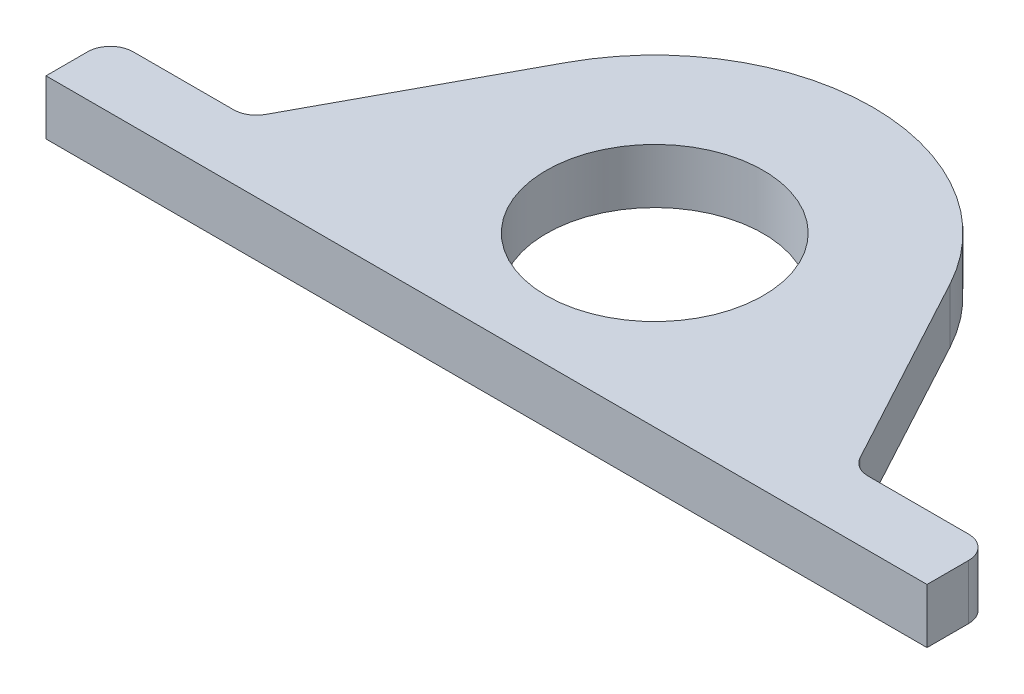
ISO-10303-21;
HEADER;
FILE_DESCRIPTION(('STEP AP214'),'2;1');
FILE_NAME('part.step','',(''),(''),'','','');
FILE_SCHEMA(('AUTOMOTIVE_DESIGN { 1 0 10303 214 1 1 1 1 }'));
ENDSEC;
DATA;
#1=APPLICATION_CONTEXT('core data for automotive mechanical design processes');
#2=APPLICATION_PROTOCOL_DEFINITION('international standard','automotive_design',2000,#1);
#3=PRODUCT_CONTEXT('',#1,'mechanical');
#4=PRODUCT('Part','Part','',(#3));
#5=PRODUCT_RELATED_PRODUCT_CATEGORY('part','',(#4));
#6=PRODUCT_DEFINITION_FORMATION('','',#4);
#7=PRODUCT_DEFINITION_CONTEXT('part definition',#1,'design');
#8=PRODUCT_DEFINITION('design','',#6,#7);
#9=PRODUCT_DEFINITION_SHAPE('','',#8);
#10=(LENGTH_UNIT() NAMED_UNIT(*) SI_UNIT(.MILLI.,.METRE.));
#11=(NAMED_UNIT(*) PLANE_ANGLE_UNIT() SI_UNIT($,.RADIAN.));
#12=(NAMED_UNIT(*) SI_UNIT($,.STERADIAN.) SOLID_ANGLE_UNIT());
#13=UNCERTAINTY_MEASURE_WITH_UNIT(LENGTH_MEASURE(1.E-05),#10,'distance_accuracy_value','');
#14=(GEOMETRIC_REPRESENTATION_CONTEXT(3) GLOBAL_UNCERTAINTY_ASSIGNED_CONTEXT((#13)) GLOBAL_UNIT_ASSIGNED_CONTEXT((#10,
#11,#12)) REPRESENTATION_CONTEXT('',''));
#15=CARTESIAN_POINT('',(0.,0.,0.));
#16=DIRECTION('',(0.,0.,1.));
#17=DIRECTION('',(1.,0.,0.));
#18=AXIS2_PLACEMENT_3D('',#15,#16,#17);
#19=CARTESIAN_POINT('',(-91.605676950577,12.,27.7755528274665));
#20=DIRECTION('',(0.,-1.,0.));
#21=DIRECTION('',(0.,0.,-1.));
#22=AXIS2_PLACEMENT_3D('',#19,#20,#21);
#23=PLANE('',#22);
#24=DIRECTION('',(0.,0.,1.));
#25=VECTOR('',#24,1.);
#26=CARTESIAN_POINT('',(-96.605676950577,12.,27.7755528274665));
#27=LINE('',#26,#25);
#28=CARTESIAN_POINT('',(-96.605676950577,12.,27.7755528274665));
#29=VERTEX_POINT('',#28);
#30=CARTESIAN_POINT('',(-96.605676950577,12.,36.9));
#31=VERTEX_POINT('',#30);
#32=EDGE_CURVE('E148',#29,#31,#27,.T.);
#33=ORIENTED_EDGE('',*,*,#32,.T.);
#34=DIRECTION('',(1.,0.,0.));
#35=VECTOR('',#34,1.);
#36=CARTESIAN_POINT('',(-91.605676950577,12.,36.9));
#37=LINE('',#36,#35);
#38=CARTESIAN_POINT('',(96.6056769505771,12.,36.9));
#39=VERTEX_POINT('',#38);
#40=EDGE_CURVE('E48',#31,#39,#37,.T.);
#41=ORIENTED_EDGE('',*,*,#40,.T.);
#42=DIRECTION('',(0.,0.,-1.));
#43=VECTOR('',#42,1.);
#44=CARTESIAN_POINT('',(96.605676950577,12.,27.7755528274665));
#45=LINE('',#44,#43);
#46=CARTESIAN_POINT('',(96.605676950577,12.,27.7755528274665));
#47=VERTEX_POINT('',#46);
#48=EDGE_CURVE('E102',#39,#47,#45,.T.);
#49=ORIENTED_EDGE('',*,*,#48,.T.);
#50=CARTESIAN_POINT('',(91.605676950577,12.,27.7755528274665));
#51=DIRECTION('',(0.,1.,0.));
#52=DIRECTION('',(0.,0.,-1.));
#53=AXIS2_PLACEMENT_3D('',#50,#51,#52);
#54=CIRCLE('',#53,5.00000000000001);
#55=CARTESIAN_POINT('',(91.605676950577,12.,22.7755528274664));
#56=VERTEX_POINT('',#55);
#57=EDGE_CURVE('E199',#47,#56,#54,.T.);
#58=ORIENTED_EDGE('',*,*,#57,.T.);
#59=DIRECTION('',(-1.,0.,0.));
#60=VECTOR('',#59,1.);
#61=CARTESIAN_POINT('',(69.5890954122525,12.,22.7755528274664));
#62=LINE('',#61,#60);
#63=CARTESIAN_POINT('',(69.5890954122525,12.,22.7755528274664));
#64=VERTEX_POINT('',#63);
#65=EDGE_CURVE('E221',#56,#64,#62,.T.);
#66=ORIENTED_EDGE('',*,*,#65,.T.);
#67=CARTESIAN_POINT('',(69.5890954122525,12.,17.7755528274664));
#68=DIRECTION('',(0.,-1.,0.));
#69=DIRECTION('',(0.,0.,1.));
#70=AXIS2_PLACEMENT_3D('',#67,#68,#69);
#71=CIRCLE('',#70,5.00000000000001);
#72=CARTESIAN_POINT('',(65.1888751835243,12.,20.1500131743014));
#73=VERTEX_POINT('',#72);
#74=EDGE_CURVE('E218',#64,#73,#71,.T.);
#75=ORIENTED_EDGE('',*,*,#74,.T.);
#76=DIRECTION('',(-0.474892069366983,0.,-0.880044045745635));
#77=VECTOR('',#76,1.);
#78=CARTESIAN_POINT('',(42.0661053866413,12.,-22.6998409157418));
#79=LINE('',#78,#77);
#80=CARTESIAN_POINT('',(42.0661053866413,12.,-22.6998409157418));
#81=VERTEX_POINT('',#80);
#82=EDGE_CURVE('E220',#73,#81,#79,.T.);
#83=ORIENTED_EDGE('',*,*,#82,.T.);
#84=CARTESIAN_POINT('',(0.,12.,0.));
#85=DIRECTION('',(0.,1.,0.));
#86=DIRECTION('',(0.,0.,1.));
#87=AXIS2_PLACEMENT_3D('',#84,#85,#86);
#88=CIRCLE('',#87,47.8);
#89=CARTESIAN_POINT('',(-42.0661053866413,12.,-22.6998409157417));
#90=VERTEX_POINT('',#89);
#91=EDGE_CURVE('E223',#81,#90,#88,.T.);
#92=ORIENTED_EDGE('',*,*,#91,.T.);
#93=DIRECTION('',(-0.474892069366983,0.,0.880044045745635));
#94=VECTOR('',#93,1.);
#95=CARTESIAN_POINT('',(-65.1888751835243,12.,20.1500131743014));
#96=LINE('',#95,#94);
#97=CARTESIAN_POINT('',(-65.1888751835243,12.,20.1500131743014));
#98=VERTEX_POINT('',#97);
#99=EDGE_CURVE('E131',#90,#98,#96,.T.);
#100=ORIENTED_EDGE('',*,*,#99,.T.);
#101=CARTESIAN_POINT('',(-69.5890954122525,12.,17.7755528274665));
#102=DIRECTION('',(0.,-1.,0.));
#103=DIRECTION('',(0.,0.,-1.));
#104=AXIS2_PLACEMENT_3D('',#101,#102,#103);
#105=CIRCLE('',#104,5.00000000000001);
#106=CARTESIAN_POINT('',(-69.5890954122525,12.,22.7755528274665));
#107=VERTEX_POINT('',#106);
#108=EDGE_CURVE('E124',#98,#107,#105,.T.);
#109=ORIENTED_EDGE('',*,*,#108,.T.);
#110=DIRECTION('',(-1.,0.,0.));
#111=VECTOR('',#110,1.);
#112=CARTESIAN_POINT('',(-69.5890954122525,12.,22.7755528274665));
#113=LINE('',#112,#111);
#114=CARTESIAN_POINT('',(-91.605676950577,12.,22.7755528274665));
#115=VERTEX_POINT('',#114);
#116=EDGE_CURVE('E128',#107,#115,#113,.T.);
#117=ORIENTED_EDGE('',*,*,#116,.T.);
#118=CARTESIAN_POINT('',(-91.605676950577,12.,27.7755528274665));
#119=DIRECTION('',(0.,1.,0.));
#120=DIRECTION('',(0.,0.,-1.));
#121=AXIS2_PLACEMENT_3D('',#118,#119,#120);
#122=CIRCLE('',#121,5.00000000000001);
#123=EDGE_CURVE('E56',#115,#29,#122,.T.);
#124=ORIENTED_EDGE('',*,*,#123,.T.);
#125=EDGE_LOOP('',(#33,#41,#49,#58,#66,#75,#83,#92,#100,#109,#117,#124));
#126=FACE_BOUND('',#125,.T.);
#127=CARTESIAN_POINT('',(0.,12.,0.));
#128=DIRECTION('',(0.,1.,0.));
#129=DIRECTION('',(0.,0.,1.));
#130=AXIS2_PLACEMENT_3D('',#127,#128,#129);
#131=CIRCLE('',#130,23.8);
#132=CARTESIAN_POINT('',(0.,12.,23.8));
#133=VERTEX_POINT('',#132);
#134=EDGE_CURVE('E157',#133,#133,#131,.T.);
#135=ORIENTED_EDGE('',*,*,#134,.F.);
#136=EDGE_LOOP('',(#135));
#137=FACE_BOUND('',#136,.T.);
#138=ADVANCED_FACE('F33',(#126,#137),#23,.F.);
#139=CARTESIAN_POINT('',(-91.605676950577,0.,27.7755528274665));
#140=DIRECTION('',(0.,-1.,0.));
#141=DIRECTION('',(0.,0.,-1.));
#142=AXIS2_PLACEMENT_3D('',#139,#140,#141);
#143=PLANE('',#142);
#144=DIRECTION('',(1.,0.,0.));
#145=VECTOR('',#144,1.);
#146=CARTESIAN_POINT('',(125.573108323714,0.,36.9));
#147=LINE('',#146,#145);
#148=CARTESIAN_POINT('',(-96.605676950577,0.,36.9));
#149=VERTEX_POINT('',#148);
#150=CARTESIAN_POINT('',(96.605676950577,0.,36.9));
#151=VERTEX_POINT('',#150);
#152=EDGE_CURVE('E243',#149,#151,#147,.T.);
#153=ORIENTED_EDGE('',*,*,#152,.F.);
#154=DIRECTION('',(0.,0.,1.));
#155=VECTOR('',#154,1.);
#156=CARTESIAN_POINT('',(-96.605676950577,0.,27.7755528274665));
#157=LINE('',#156,#155);
#158=CARTESIAN_POINT('',(-96.605676950577,0.,27.7755528274665));
#159=VERTEX_POINT('',#158);
#160=EDGE_CURVE('E173',#159,#149,#157,.T.);
#161=ORIENTED_EDGE('',*,*,#160,.F.);
#162=CARTESIAN_POINT('',(-91.605676950577,0.,27.7755528274665));
#163=DIRECTION('',(0.,1.,0.));
#164=DIRECTION('',(0.,0.,-1.));
#165=AXIS2_PLACEMENT_3D('',#162,#163,#164);
#166=CIRCLE('',#165,5.00000000000001);
#167=CARTESIAN_POINT('',(-91.605676950577,0.,22.7755528274665));
#168=VERTEX_POINT('',#167);
#169=EDGE_CURVE('E95',#168,#159,#166,.T.);
#170=ORIENTED_EDGE('',*,*,#169,.F.);
#171=DIRECTION('',(-1.,0.,0.));
#172=VECTOR('',#171,1.);
#173=CARTESIAN_POINT('',(-69.5890954122525,0.,22.7755528274665));
#174=LINE('',#173,#172);
#175=CARTESIAN_POINT('',(-69.5890954122525,0.,22.7755528274665));
#176=VERTEX_POINT('',#175);
#177=EDGE_CURVE('E170',#176,#168,#174,.T.);
#178=ORIENTED_EDGE('',*,*,#177,.F.);
#179=CARTESIAN_POINT('',(-69.5890954122525,0.,17.7755528274665));
#180=DIRECTION('',(0.,-1.,0.));
#181=DIRECTION('',(0.,0.,-1.));
#182=AXIS2_PLACEMENT_3D('',#179,#180,#181);
#183=CIRCLE('',#182,5.00000000000001);
#184=CARTESIAN_POINT('',(-65.1888751835243,0.,20.1500131743014));
#185=VERTEX_POINT('',#184);
#186=EDGE_CURVE('E140',#185,#176,#183,.T.);
#187=ORIENTED_EDGE('',*,*,#186,.F.);
#188=DIRECTION('',(-0.474892069366983,0.,0.880044045745635));
#189=VECTOR('',#188,1.);
#190=CARTESIAN_POINT('',(-65.1888751835243,0.,20.1500131743014));
#191=LINE('',#190,#189);
#192=CARTESIAN_POINT('',(-42.0661053866413,0.,-22.6998409157417));
#193=VERTEX_POINT('',#192);
#194=EDGE_CURVE('E167',#193,#185,#191,.T.);
#195=ORIENTED_EDGE('',*,*,#194,.F.);
#196=CARTESIAN_POINT('',(0.,0.,0.));
#197=DIRECTION('',(0.,1.,0.));
#198=DIRECTION('',(0.,0.,1.));
#199=AXIS2_PLACEMENT_3D('',#196,#197,#198);
#200=CIRCLE('',#199,47.8);
#201=CARTESIAN_POINT('',(42.0661053866413,0.,-22.6998409157418));
#202=VERTEX_POINT('',#201);
#203=EDGE_CURVE('E165',#202,#193,#200,.T.);
#204=ORIENTED_EDGE('',*,*,#203,.F.);
#205=DIRECTION('',(-0.474892069366983,0.,-0.880044045745635));
#206=VECTOR('',#205,1.);
#207=CARTESIAN_POINT('',(42.0661053866413,0.,-22.6998409157418));
#208=LINE('',#207,#206);
#209=CARTESIAN_POINT('',(65.1888751835243,0.,20.1500131743014));
#210=VERTEX_POINT('',#209);
#211=EDGE_CURVE('E163',#210,#202,#208,.T.);
#212=ORIENTED_EDGE('',*,*,#211,.F.);
#213=CARTESIAN_POINT('',(69.5890954122525,0.,17.7755528274664));
#214=DIRECTION('',(0.,-1.,0.));
#215=DIRECTION('',(0.,0.,1.));
#216=AXIS2_PLACEMENT_3D('',#213,#214,#215);
#217=CIRCLE('',#216,5.00000000000001);
#218=CARTESIAN_POINT('',(69.5890954122525,0.,22.7755528274664));
#219=VERTEX_POINT('',#218);
#220=EDGE_CURVE('E161',#219,#210,#217,.T.);
#221=ORIENTED_EDGE('',*,*,#220,.F.);
#222=DIRECTION('',(-1.,0.,0.));
#223=VECTOR('',#222,1.);
#224=CARTESIAN_POINT('',(69.5890954122525,0.,22.7755528274664));
#225=LINE('',#224,#223);
#226=CARTESIAN_POINT('',(91.605676950577,0.,22.7755528274664));
#227=VERTEX_POINT('',#226);
#228=EDGE_CURVE('E159',#227,#219,#225,.T.);
#229=ORIENTED_EDGE('',*,*,#228,.F.);
#230=CARTESIAN_POINT('',(91.605676950577,0.,27.7755528274665));
#231=DIRECTION('',(0.,1.,0.));
#232=DIRECTION('',(0.,0.,-1.));
#233=AXIS2_PLACEMENT_3D('',#230,#231,#232);
#234=CIRCLE('',#233,5.00000000000001);
#235=CARTESIAN_POINT('',(96.605676950577,0.,27.7755528274665));
#236=VERTEX_POINT('',#235);
#237=EDGE_CURVE('E156',#236,#227,#234,.T.);
#238=ORIENTED_EDGE('',*,*,#237,.F.);
#239=DIRECTION('',(0.,0.,-1.));
#240=VECTOR('',#239,1.);
#241=CARTESIAN_POINT('',(96.605676950577,0.,27.7755528274665));
#242=LINE('',#241,#240);
#243=EDGE_CURVE('E154',#151,#236,#242,.T.);
#244=ORIENTED_EDGE('',*,*,#243,.F.);
#245=EDGE_LOOP('',(#153,#161,#170,#178,#187,#195,#204,#212,#221,#229,#238,#244));
#246=FACE_BOUND('',#245,.T.);
#247=CARTESIAN_POINT('',(0.,0.,0.));
#248=DIRECTION('',(0.,1.,0.));
#249=DIRECTION('',(0.,0.,1.));
#250=AXIS2_PLACEMENT_3D('',#247,#248,#249);
#251=CIRCLE('',#250,23.8);
#252=CARTESIAN_POINT('',(0.,0.,23.8));
#253=VERTEX_POINT('',#252);
#254=EDGE_CURVE('E248',#253,#253,#251,.T.);
#255=ORIENTED_EDGE('',*,*,#254,.T.);
#256=EDGE_LOOP('',(#255));
#257=FACE_BOUND('',#256,.T.);
#258=ADVANCED_FACE('F205',(#246,#257),#143,.T.);
#259=CARTESIAN_POINT('',(96.605676950577,12.,27.7755528274665));
#260=DIRECTION('',(-1.,0.,0.));
#261=DIRECTION('',(0.,0.,1.));
#262=AXIS2_PLACEMENT_3D('',#259,#260,#261);
#263=PLANE('',#262);
#264=ORIENTED_EDGE('',*,*,#48,.F.);
#265=DIRECTION('',(0.,-1.,0.));
#266=VECTOR('',#265,1.);
#267=CARTESIAN_POINT('',(96.605676950577,12.,36.9));
#268=LINE('',#267,#266);
#269=EDGE_CURVE('E242',#39,#151,#268,.T.);
#270=ORIENTED_EDGE('',*,*,#269,.T.);
#271=ORIENTED_EDGE('',*,*,#243,.T.);
#272=DIRECTION('',(0.,-1.,0.));
#273=VECTOR('',#272,1.);
#274=CARTESIAN_POINT('',(96.605676950577,12.,27.7755528274665));
#275=LINE('',#274,#273);
#276=EDGE_CURVE('E41',#47,#236,#275,.T.);
#277=ORIENTED_EDGE('',*,*,#276,.F.);
#278=EDGE_LOOP('',(#264,#270,#271,#277));
#279=FACE_BOUND('',#278,.T.);
#280=ADVANCED_FACE('F35',(#279),#263,.F.);
#281=CARTESIAN_POINT('',(91.605676950577,12.,27.7755528274665));
#282=DIRECTION('',(0.,-1.,0.));
#283=DIRECTION('',(0.,0.,-1.));
#284=AXIS2_PLACEMENT_3D('',#281,#282,#283);
#285=CYLINDRICAL_SURFACE('',#284,5.00000000000001);
#286=ORIENTED_EDGE('',*,*,#237,.T.);
#287=DIRECTION('',(0.,-1.,0.));
#288=VECTOR('',#287,1.);
#289=CARTESIAN_POINT('',(91.605676950577,12.,22.7755528274664));
#290=LINE('',#289,#288);
#291=EDGE_CURVE('E191',#56,#227,#290,.T.);
#292=ORIENTED_EDGE('',*,*,#291,.F.);
#293=ORIENTED_EDGE('',*,*,#57,.F.);
#294=ORIENTED_EDGE('',*,*,#276,.T.);
#295=EDGE_LOOP('',(#286,#292,#293,#294));
#296=FACE_BOUND('',#295,.T.);
#297=ADVANCED_FACE('F197',(#296),#285,.T.);
#298=CARTESIAN_POINT('',(69.5890954122525,12.,22.7755528274664));
#299=DIRECTION('',(0.,0.,1.));
#300=DIRECTION('',(1.,0.,0.));
#301=AXIS2_PLACEMENT_3D('',#298,#299,#300);
#302=PLANE('',#301);
#303=ORIENTED_EDGE('',*,*,#228,.T.);
#304=DIRECTION('',(0.,-1.,0.));
#305=VECTOR('',#304,1.);
#306=CARTESIAN_POINT('',(69.5890954122525,12.,22.7755528274664));
#307=LINE('',#306,#305);
#308=EDGE_CURVE('E188',#64,#219,#307,.T.);
#309=ORIENTED_EDGE('',*,*,#308,.F.);
#310=ORIENTED_EDGE('',*,*,#65,.F.);
#311=ORIENTED_EDGE('',*,*,#291,.T.);
#312=EDGE_LOOP('',(#303,#309,#310,#311));
#313=FACE_BOUND('',#312,.T.);
#314=ADVANCED_FACE('F212',(#313),#302,.F.);
#315=CARTESIAN_POINT('',(69.5890954122525,12.,17.7755528274664));
#316=DIRECTION('',(0.,-1.,0.));
#317=DIRECTION('',(0.,0.,-1.));
#318=AXIS2_PLACEMENT_3D('',#315,#316,#317);
#319=CYLINDRICAL_SURFACE('',#318,5.00000000000001);
#320=ORIENTED_EDGE('',*,*,#220,.T.);
#321=DIRECTION('',(0.,-1.,0.));
#322=VECTOR('',#321,1.);
#323=CARTESIAN_POINT('',(65.1888751835243,12.,20.1500131743014));
#324=LINE('',#323,#322);
#325=EDGE_CURVE('E185',#73,#210,#324,.T.);
#326=ORIENTED_EDGE('',*,*,#325,.F.);
#327=ORIENTED_EDGE('',*,*,#74,.F.);
#328=ORIENTED_EDGE('',*,*,#308,.T.);
#329=EDGE_LOOP('',(#320,#326,#327,#328));
#330=FACE_BOUND('',#329,.T.);
#331=ADVANCED_FACE('F216',(#330),#319,.F.);
#332=CARTESIAN_POINT('',(42.0661053866413,12.,-22.6998409157418));
#333=DIRECTION('',(-0.880044045745635,0.,0.474892069366983));
#334=DIRECTION('',(0.474892069366983,0.,0.880044045745635));
#335=AXIS2_PLACEMENT_3D('',#332,#333,#334);
#336=PLANE('',#335);
#337=ORIENTED_EDGE('',*,*,#211,.T.);
#338=DIRECTION('',(0.,-1.,0.));
#339=VECTOR('',#338,1.);
#340=CARTESIAN_POINT('',(42.0661053866413,12.,-22.6998409157418));
#341=LINE('',#340,#339);
#342=EDGE_CURVE('E182',#81,#202,#341,.T.);
#343=ORIENTED_EDGE('',*,*,#342,.F.);
#344=ORIENTED_EDGE('',*,*,#82,.F.);
#345=ORIENTED_EDGE('',*,*,#325,.T.);
#346=EDGE_LOOP('',(#337,#343,#344,#345));
#347=FACE_BOUND('',#346,.T.);
#348=ADVANCED_FACE('F285',(#347),#336,.F.);
#349=CARTESIAN_POINT('',(0.,12.,0.));
#350=DIRECTION('',(0.,-1.,0.));
#351=DIRECTION('',(0.,0.,-1.));
#352=AXIS2_PLACEMENT_3D('',#349,#350,#351);
#353=CYLINDRICAL_SURFACE('',#352,47.8);
#354=ORIENTED_EDGE('',*,*,#203,.T.);
#355=DIRECTION('',(0.,-1.,0.));
#356=VECTOR('',#355,1.);
#357=CARTESIAN_POINT('',(-42.0661053866413,12.,-22.6998409157417));
#358=LINE('',#357,#356);
#359=EDGE_CURVE('E179',#90,#193,#358,.T.);
#360=ORIENTED_EDGE('',*,*,#359,.F.);
#361=ORIENTED_EDGE('',*,*,#91,.F.);
#362=ORIENTED_EDGE('',*,*,#342,.T.);
#363=EDGE_LOOP('',(#354,#360,#361,#362));
#364=FACE_BOUND('',#363,.T.);
#365=ADVANCED_FACE('F232',(#364),#353,.T.);
#366=CARTESIAN_POINT('',(-65.1888751835243,12.,20.1500131743014));
#367=DIRECTION('',(0.880044045745635,0.,0.474892069366983));
#368=DIRECTION('',(0.474892069366983,0.,-0.880044045745635));
#369=AXIS2_PLACEMENT_3D('',#366,#367,#368);
#370=PLANE('',#369);
#371=ORIENTED_EDGE('',*,*,#194,.T.);
#372=DIRECTION('',(0.,-1.,0.));
#373=VECTOR('',#372,1.);
#374=CARTESIAN_POINT('',(-65.1888751835243,12.,20.1500131743014));
#375=LINE('',#374,#373);
#376=EDGE_CURVE('E143',#98,#185,#375,.T.);
#377=ORIENTED_EDGE('',*,*,#376,.F.);
#378=ORIENTED_EDGE('',*,*,#99,.F.);
#379=ORIENTED_EDGE('',*,*,#359,.T.);
#380=EDGE_LOOP('',(#371,#377,#378,#379));
#381=FACE_BOUND('',#380,.T.);
#382=ADVANCED_FACE('F236',(#381),#370,.F.);
#383=CARTESIAN_POINT('',(-69.5890954122525,12.,17.7755528274665));
#384=DIRECTION('',(0.,-1.,0.));
#385=DIRECTION('',(0.,0.,-1.));
#386=AXIS2_PLACEMENT_3D('',#383,#384,#385);
#387=CYLINDRICAL_SURFACE('',#386,5.00000000000001);
#388=ORIENTED_EDGE('',*,*,#186,.T.);
#389=DIRECTION('',(0.,-1.,0.));
#390=VECTOR('',#389,1.);
#391=CARTESIAN_POINT('',(-69.5890954122525,12.,22.7755528274665));
#392=LINE('',#391,#390);
#393=EDGE_CURVE('E137',#107,#176,#392,.T.);
#394=ORIENTED_EDGE('',*,*,#393,.F.);
#395=ORIENTED_EDGE('',*,*,#108,.F.);
#396=ORIENTED_EDGE('',*,*,#376,.T.);
#397=EDGE_LOOP('',(#388,#394,#395,#396));
#398=FACE_BOUND('',#397,.T.);
#399=ADVANCED_FACE('F138',(#398),#387,.F.);
#400=CARTESIAN_POINT('',(-69.5890954122525,12.,22.7755528274665));
#401=DIRECTION('',(0.,0.,1.));
#402=DIRECTION('',(1.,0.,0.));
#403=AXIS2_PLACEMENT_3D('',#400,#401,#402);
#404=PLANE('',#403);
#405=ORIENTED_EDGE('',*,*,#177,.T.);
#406=DIRECTION('',(0.,-1.,0.));
#407=VECTOR('',#406,1.);
#408=CARTESIAN_POINT('',(-91.605676950577,12.,22.7755528274665));
#409=LINE('',#408,#407);
#410=EDGE_CURVE('E144',#115,#168,#409,.T.);
#411=ORIENTED_EDGE('',*,*,#410,.F.);
#412=ORIENTED_EDGE('',*,*,#116,.F.);
#413=ORIENTED_EDGE('',*,*,#393,.T.);
#414=EDGE_LOOP('',(#405,#411,#412,#413));
#415=FACE_BOUND('',#414,.T.);
#416=ADVANCED_FACE('F146',(#415),#404,.F.);
#417=CARTESIAN_POINT('',(-91.605676950577,12.,27.7755528274665));
#418=DIRECTION('',(0.,-1.,0.));
#419=DIRECTION('',(0.,0.,-1.));
#420=AXIS2_PLACEMENT_3D('',#417,#418,#419);
#421=CYLINDRICAL_SURFACE('',#420,5.00000000000001);
#422=ORIENTED_EDGE('',*,*,#169,.T.);
#423=DIRECTION('',(0.,-1.,0.));
#424=VECTOR('',#423,1.);
#425=CARTESIAN_POINT('',(-96.605676950577,12.,27.7755528274665));
#426=LINE('',#425,#424);
#427=EDGE_CURVE('E153',#29,#159,#426,.T.);
#428=ORIENTED_EDGE('',*,*,#427,.F.);
#429=ORIENTED_EDGE('',*,*,#123,.F.);
#430=ORIENTED_EDGE('',*,*,#410,.T.);
#431=EDGE_LOOP('',(#422,#428,#429,#430));
#432=FACE_BOUND('',#431,.T.);
#433=ADVANCED_FACE('F238',(#432),#421,.T.);
#434=CARTESIAN_POINT('',(-96.605676950577,12.,27.7755528274665));
#435=DIRECTION('',(1.,0.,0.));
#436=DIRECTION('',(0.,0.,-1.));
#437=AXIS2_PLACEMENT_3D('',#434,#435,#436);
#438=PLANE('',#437);
#439=ORIENTED_EDGE('',*,*,#160,.T.);
#440=DIRECTION('',(0.,1.,0.));
#441=VECTOR('',#440,1.);
#442=CARTESIAN_POINT('',(-96.605676950577,12.,36.9));
#443=LINE('',#442,#441);
#444=EDGE_CURVE('E11',#149,#31,#443,.T.);
#445=ORIENTED_EDGE('',*,*,#444,.T.);
#446=ORIENTED_EDGE('',*,*,#32,.F.);
#447=ORIENTED_EDGE('',*,*,#427,.T.);
#448=EDGE_LOOP('',(#439,#445,#446,#447));
#449=FACE_BOUND('',#448,.T.);
#450=ADVANCED_FACE('F241',(#449),#438,.F.);
#451=CARTESIAN_POINT('',(0.,12.,0.));
#452=DIRECTION('',(0.,-1.,0.));
#453=DIRECTION('',(0.,0.,-1.));
#454=AXIS2_PLACEMENT_3D('',#451,#452,#453);
#455=CYLINDRICAL_SURFACE('',#454,23.8);
#456=ORIENTED_EDGE('',*,*,#134,.T.);
#457=EDGE_LOOP('',(#456));
#458=FACE_BOUND('',#457,.T.);
#459=ORIENTED_EDGE('',*,*,#254,.F.);
#460=EDGE_LOOP('',(#459));
#461=FACE_BOUND('',#460,.T.);
#462=ADVANCED_FACE('F259',(#458,#461),#455,.F.);
#463=CARTESIAN_POINT('',(125.573108323714,26.,36.9));
#464=DIRECTION('',(0.,0.,-1.));
#465=DIRECTION('',(-1.,0.,0.));
#466=AXIS2_PLACEMENT_3D('',#463,#464,#465);
#467=PLANE('',#466);
#468=ORIENTED_EDGE('',*,*,#40,.F.);
#469=ORIENTED_EDGE('',*,*,#444,.F.);
#470=ORIENTED_EDGE('',*,*,#152,.T.);
#471=ORIENTED_EDGE('',*,*,#269,.F.);
#472=EDGE_LOOP('',(#468,#469,#470,#471));
#473=FACE_BOUND('',#472,.T.);
#474=ADVANCED_FACE('F255',(#473),#467,.F.);
#475=CLOSED_SHELL('',(#138,#258,#280,#297,#314,#331,#348,#365,#382,#399,#416,#433,#450,#462,#474));
#476=MANIFOLD_SOLID_BREP('B2',#475);
#477=ADVANCED_BREP_SHAPE_REPRESENTATION('',(#18,#476),#14);
#478=SHAPE_DEFINITION_REPRESENTATION(#9,#477);
ENDSEC;
END-ISO-10303-21;
